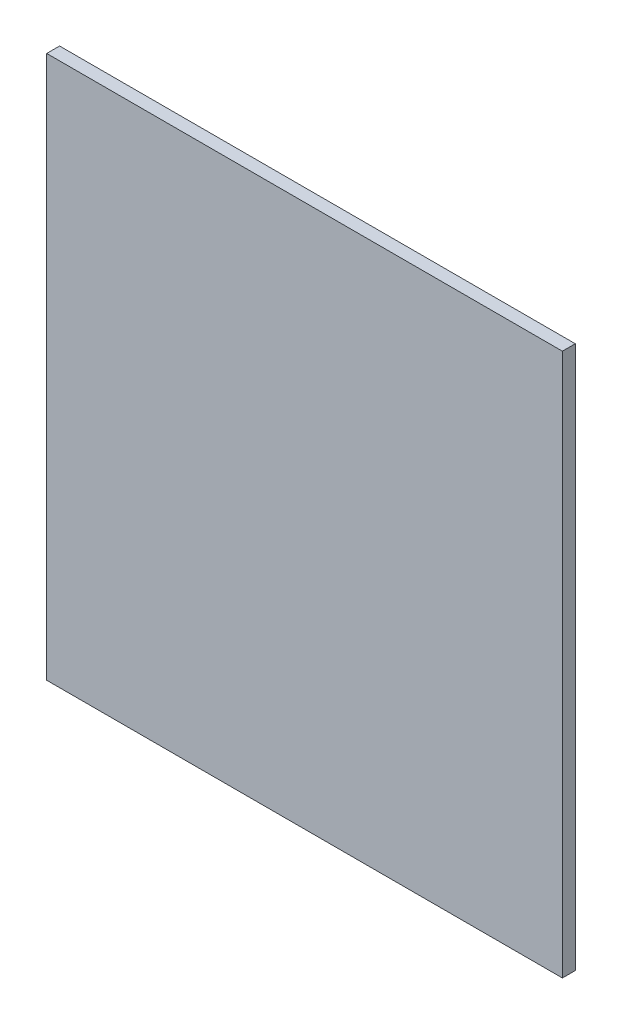
ISO-10303-21;
HEADER;
FILE_DESCRIPTION(('STEP AP214'),'2;1');
FILE_NAME('part.step','',(''),(''),'','','');
FILE_SCHEMA(('AUTOMOTIVE_DESIGN { 1 0 10303 214 1 1 1 1 }'));
ENDSEC;
DATA;
#1=APPLICATION_CONTEXT('core data for automotive mechanical design processes');
#2=APPLICATION_PROTOCOL_DEFINITION('international standard','automotive_design',2000,#1);
#3=PRODUCT_CONTEXT('',#1,'mechanical');
#4=PRODUCT('Part','Part','',(#3));
#5=PRODUCT_RELATED_PRODUCT_CATEGORY('part','',(#4));
#6=PRODUCT_DEFINITION_FORMATION('','',#4);
#7=PRODUCT_DEFINITION_CONTEXT('part definition',#1,'design');
#8=PRODUCT_DEFINITION('design','',#6,#7);
#9=PRODUCT_DEFINITION_SHAPE('','',#8);
#10=(LENGTH_UNIT() NAMED_UNIT(*) SI_UNIT(.MILLI.,.METRE.));
#11=(NAMED_UNIT(*) PLANE_ANGLE_UNIT() SI_UNIT($,.RADIAN.));
#12=(NAMED_UNIT(*) SI_UNIT($,.STERADIAN.) SOLID_ANGLE_UNIT());
#13=UNCERTAINTY_MEASURE_WITH_UNIT(LENGTH_MEASURE(1.E-05),#10,'distance_accuracy_value','');
#14=(GEOMETRIC_REPRESENTATION_CONTEXT(3) GLOBAL_UNCERTAINTY_ASSIGNED_CONTEXT((#13)) GLOBAL_UNIT_ASSIGNED_CONTEXT((#10,
#11,#12)) REPRESENTATION_CONTEXT('',''));
#15=CARTESIAN_POINT('',(0.,0.,0.));
#16=DIRECTION('',(0.,0.,1.));
#17=DIRECTION('',(1.,0.,0.));
#18=AXIS2_PLACEMENT_3D('',#15,#16,#17);
#19=CARTESIAN_POINT('',(-380.,400.,9.5));
#20=DIRECTION('',(1.,0.,0.));
#21=DIRECTION('',(0.,1.,0.));
#22=AXIS2_PLACEMENT_3D('',#19,#20,#21);
#23=PLANE('',#22);
#24=DIRECTION('',(0.,-1.,0.));
#25=VECTOR('',#24,1.);
#26=CARTESIAN_POINT('',(-380.,400.,-9.5));
#27=LINE('',#26,#25);
#28=CARTESIAN_POINT('',(-380.,400.,-9.5));
#29=VERTEX_POINT('',#28);
#30=CARTESIAN_POINT('',(-380.,-400.,-9.5));
#31=VERTEX_POINT('',#30);
#32=EDGE_CURVE('E96',#29,#31,#27,.T.);
#33=ORIENTED_EDGE('',*,*,#32,.T.);
#34=DIRECTION('',(0.,0.,-1.));
#35=VECTOR('',#34,1.);
#36=CARTESIAN_POINT('',(-380.,-400.,9.5));
#37=LINE('',#36,#35);
#38=CARTESIAN_POINT('',(-380.,-400.,9.5));
#39=VERTEX_POINT('',#38);
#40=EDGE_CURVE('E11',#39,#31,#37,.T.);
#41=ORIENTED_EDGE('',*,*,#40,.F.);
#42=DIRECTION('',(0.,-1.,0.));
#43=VECTOR('',#42,1.);
#44=CARTESIAN_POINT('',(-380.,400.,9.5));
#45=LINE('',#44,#43);
#46=CARTESIAN_POINT('',(-380.,400.,9.5));
#47=VERTEX_POINT('',#46);
#48=EDGE_CURVE('E84',#47,#39,#45,.T.);
#49=ORIENTED_EDGE('',*,*,#48,.F.);
#50=DIRECTION('',(0.,0.,-1.));
#51=VECTOR('',#50,1.);
#52=CARTESIAN_POINT('',(-380.,400.,9.5));
#53=LINE('',#52,#51);
#54=EDGE_CURVE('E92',#47,#29,#53,.T.);
#55=ORIENTED_EDGE('',*,*,#54,.T.);
#56=EDGE_LOOP('',(#33,#41,#49,#55));
#57=FACE_BOUND('',#56,.T.);
#58=ADVANCED_FACE('F33',(#57),#23,.F.);
#59=CARTESIAN_POINT('',(380.,-400.,9.5));
#60=DIRECTION('',(0.,1.,0.));
#61=DIRECTION('',(-1.,0.,0.));
#62=AXIS2_PLACEMENT_3D('',#59,#60,#61);
#63=PLANE('',#62);
#64=DIRECTION('',(1.,0.,0.));
#65=VECTOR('',#64,1.);
#66=CARTESIAN_POINT('',(380.,-400.,-9.5));
#67=LINE('',#66,#65);
#68=CARTESIAN_POINT('',(380.,-400.,-9.5));
#69=VERTEX_POINT('',#68);
#70=EDGE_CURVE('E88',#31,#69,#67,.T.);
#71=ORIENTED_EDGE('',*,*,#70,.T.);
#72=DIRECTION('',(0.,0.,-1.));
#73=VECTOR('',#72,1.);
#74=CARTESIAN_POINT('',(380.,-400.,9.5));
#75=LINE('',#74,#73);
#76=CARTESIAN_POINT('',(380.,-400.,9.5));
#77=VERTEX_POINT('',#76);
#78=EDGE_CURVE('E41',#77,#69,#75,.T.);
#79=ORIENTED_EDGE('',*,*,#78,.F.);
#80=DIRECTION('',(1.,0.,0.));
#81=VECTOR('',#80,1.);
#82=CARTESIAN_POINT('',(380.,-400.,9.5));
#83=LINE('',#82,#81);
#84=EDGE_CURVE('E79',#39,#77,#83,.T.);
#85=ORIENTED_EDGE('',*,*,#84,.F.);
#86=ORIENTED_EDGE('',*,*,#40,.T.);
#87=EDGE_LOOP('',(#71,#79,#85,#86));
#88=FACE_BOUND('',#87,.T.);
#89=ADVANCED_FACE('F87',(#88),#63,.F.);
#90=CARTESIAN_POINT('',(380.,400.,9.5));
#91=DIRECTION('',(-1.,0.,0.));
#92=DIRECTION('',(0.,-1.,0.));
#93=AXIS2_PLACEMENT_3D('',#90,#91,#92);
#94=PLANE('',#93);
#95=DIRECTION('',(0.,1.,0.));
#96=VECTOR('',#95,1.);
#97=CARTESIAN_POINT('',(380.,400.,-9.5));
#98=LINE('',#97,#96);
#99=CARTESIAN_POINT('',(380.,400.,-9.5));
#100=VERTEX_POINT('',#99);
#101=EDGE_CURVE('E66',#69,#100,#98,.T.);
#102=ORIENTED_EDGE('',*,*,#101,.T.);
#103=DIRECTION('',(0.,0.,-1.));
#104=VECTOR('',#103,1.);
#105=CARTESIAN_POINT('',(380.,400.,9.5));
#106=LINE('',#105,#104);
#107=CARTESIAN_POINT('',(380.,400.,9.5));
#108=VERTEX_POINT('',#107);
#109=EDGE_CURVE('E89',#108,#100,#106,.T.);
#110=ORIENTED_EDGE('',*,*,#109,.F.);
#111=DIRECTION('',(0.,1.,0.));
#112=VECTOR('',#111,1.);
#113=CARTESIAN_POINT('',(380.,400.,9.5));
#114=LINE('',#113,#112);
#115=EDGE_CURVE('E82',#77,#108,#114,.T.);
#116=ORIENTED_EDGE('',*,*,#115,.F.);
#117=ORIENTED_EDGE('',*,*,#78,.T.);
#118=EDGE_LOOP('',(#102,#110,#116,#117));
#119=FACE_BOUND('',#118,.T.);
#120=ADVANCED_FACE('F90',(#119),#94,.F.);
#121=CARTESIAN_POINT('',(380.,400.,9.5));
#122=DIRECTION('',(0.,-1.,0.));
#123=DIRECTION('',(1.,0.,0.));
#124=AXIS2_PLACEMENT_3D('',#121,#122,#123);
#125=PLANE('',#124);
#126=DIRECTION('',(-1.,0.,0.));
#127=VECTOR('',#126,1.);
#128=CARTESIAN_POINT('',(380.,400.,-9.5));
#129=LINE('',#128,#127);
#130=EDGE_CURVE('E72',#100,#29,#129,.T.);
#131=ORIENTED_EDGE('',*,*,#130,.T.);
#132=ORIENTED_EDGE('',*,*,#54,.F.);
#133=DIRECTION('',(-1.,0.,0.));
#134=VECTOR('',#133,1.);
#135=CARTESIAN_POINT('',(380.,400.,9.5));
#136=LINE('',#135,#134);
#137=EDGE_CURVE('E49',#108,#47,#136,.T.);
#138=ORIENTED_EDGE('',*,*,#137,.F.);
#139=ORIENTED_EDGE('',*,*,#109,.T.);
#140=EDGE_LOOP('',(#131,#132,#138,#139));
#141=FACE_BOUND('',#140,.T.);
#142=ADVANCED_FACE('F103',(#141),#125,.F.);
#143=CARTESIAN_POINT('',(0.,0.,9.5));
#144=DIRECTION('',(0.,0.,-1.));
#145=DIRECTION('',(-1.,0.,0.));
#146=AXIS2_PLACEMENT_3D('',#143,#144,#145);
#147=PLANE('',#146);
#148=ORIENTED_EDGE('',*,*,#48,.T.);
#149=ORIENTED_EDGE('',*,*,#84,.T.);
#150=ORIENTED_EDGE('',*,*,#115,.T.);
#151=ORIENTED_EDGE('',*,*,#137,.T.);
#152=EDGE_LOOP('',(#148,#149,#150,#151));
#153=FACE_BOUND('',#152,.T.);
#154=ADVANCED_FACE('F80',(#153),#147,.F.);
#155=CARTESIAN_POINT('',(0.,0.,-9.5));
#156=DIRECTION('',(0.,0.,-1.));
#157=DIRECTION('',(-1.,0.,0.));
#158=AXIS2_PLACEMENT_3D('',#155,#156,#157);
#159=PLANE('',#158);
#160=ORIENTED_EDGE('',*,*,#32,.F.);
#161=ORIENTED_EDGE('',*,*,#130,.F.);
#162=ORIENTED_EDGE('',*,*,#101,.F.);
#163=ORIENTED_EDGE('',*,*,#70,.F.);
#164=EDGE_LOOP('',(#160,#161,#162,#163));
#165=FACE_BOUND('',#164,.T.);
#166=ADVANCED_FACE('F106',(#165),#159,.T.);
#167=CLOSED_SHELL('',(#58,#89,#120,#142,#154,#166));
#168=MANIFOLD_SOLID_BREP('B2',#167);
#169=ADVANCED_BREP_SHAPE_REPRESENTATION('',(#18,#168),#14);
#170=SHAPE_DEFINITION_REPRESENTATION(#9,#169);
ENDSEC;
END-ISO-10303-21;
